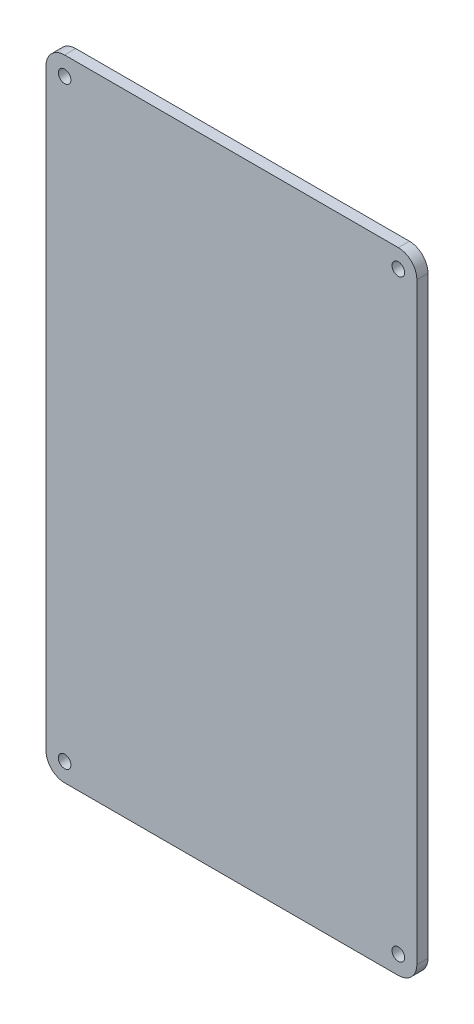
ISO-10303-21;
HEADER;
FILE_DESCRIPTION(('STEP AP214'),'2;1');
FILE_NAME('part.step','',(''),(''),'','','');
FILE_SCHEMA(('AUTOMOTIVE_DESIGN { 1 0 10303 214 1 1 1 1 }'));
ENDSEC;
DATA;
#1=APPLICATION_CONTEXT('core data for automotive mechanical design processes');
#2=APPLICATION_PROTOCOL_DEFINITION('international standard','automotive_design',2000,#1);
#3=PRODUCT_CONTEXT('',#1,'mechanical');
#4=PRODUCT('Part','Part','',(#3));
#5=PRODUCT_RELATED_PRODUCT_CATEGORY('part','',(#4));
#6=PRODUCT_DEFINITION_FORMATION('','',#4);
#7=PRODUCT_DEFINITION_CONTEXT('part definition',#1,'design');
#8=PRODUCT_DEFINITION('design','',#6,#7);
#9=PRODUCT_DEFINITION_SHAPE('','',#8);
#10=(LENGTH_UNIT() NAMED_UNIT(*) SI_UNIT(.MILLI.,.METRE.));
#11=(NAMED_UNIT(*) PLANE_ANGLE_UNIT() SI_UNIT($,.RADIAN.));
#12=(NAMED_UNIT(*) SI_UNIT($,.STERADIAN.) SOLID_ANGLE_UNIT());
#13=UNCERTAINTY_MEASURE_WITH_UNIT(LENGTH_MEASURE(1.E-05),#10,'distance_accuracy_value','');
#14=(GEOMETRIC_REPRESENTATION_CONTEXT(3) GLOBAL_UNCERTAINTY_ASSIGNED_CONTEXT((#13)) GLOBAL_UNIT_ASSIGNED_CONTEXT((#10,
#11,#12)) REPRESENTATION_CONTEXT('',''));
#15=CARTESIAN_POINT('',(0.,0.,0.));
#16=DIRECTION('',(0.,0.,1.));
#17=DIRECTION('',(1.,0.,0.));
#18=AXIS2_PLACEMENT_3D('',#15,#16,#17);
#19=CARTESIAN_POINT('',(0.,0.,3.));
#20=DIRECTION('',(1.,0.,0.));
#21=DIRECTION('',(0.,1.,0.));
#22=AXIS2_PLACEMENT_3D('',#19,#20,#21);
#23=PLANE('',#22);
#24=DIRECTION('',(0.,-1.,0.));
#25=VECTOR('',#24,1.);
#26=CARTESIAN_POINT('',(0.,0.,0.));
#27=LINE('',#26,#25);
#28=CARTESIAN_POINT('',(0.,165.,0.));
#29=VERTEX_POINT('',#28);
#30=CARTESIAN_POINT('',(0.,5.,0.));
#31=VERTEX_POINT('',#30);
#32=EDGE_CURVE('E138',#29,#31,#27,.T.);
#33=ORIENTED_EDGE('',*,*,#32,.T.);
#34=DIRECTION('',(0.,0.,-1.));
#35=VECTOR('',#34,1.);
#36=CARTESIAN_POINT('',(0.,5.,3.));
#37=LINE('',#36,#35);
#38=CARTESIAN_POINT('',(0.,5.,3.));
#39=VERTEX_POINT('',#38);
#40=EDGE_CURVE('E11',#31,#39,#37,.F.);
#41=ORIENTED_EDGE('',*,*,#40,.T.);
#42=DIRECTION('',(0.,-1.,0.));
#43=VECTOR('',#42,1.);
#44=CARTESIAN_POINT('',(0.,0.,3.));
#45=LINE('',#44,#43);
#46=CARTESIAN_POINT('',(0.,165.,3.));
#47=VERTEX_POINT('',#46);
#48=EDGE_CURVE('E126',#47,#39,#45,.T.);
#49=ORIENTED_EDGE('',*,*,#48,.F.);
#50=DIRECTION('',(0.,0.,-1.));
#51=VECTOR('',#50,1.);
#52=CARTESIAN_POINT('',(0.,165.,3.));
#53=LINE('',#52,#51);
#54=EDGE_CURVE('E42',#47,#29,#53,.T.);
#55=ORIENTED_EDGE('',*,*,#54,.T.);
#56=EDGE_LOOP('',(#33,#41,#49,#55));
#57=FACE_BOUND('',#56,.T.);
#58=ADVANCED_FACE('F34',(#57),#23,.F.);
#59=CARTESIAN_POINT('',(0.,0.,3.));
#60=DIRECTION('',(0.,1.,0.));
#61=DIRECTION('',(0.,0.,1.));
#62=AXIS2_PLACEMENT_3D('',#59,#60,#61);
#63=PLANE('',#62);
#64=DIRECTION('',(1.,0.,0.));
#65=VECTOR('',#64,1.);
#66=CARTESIAN_POINT('',(0.,0.,0.));
#67=LINE('',#66,#65);
#68=CARTESIAN_POINT('',(5.,0.,0.));
#69=VERTEX_POINT('',#68);
#70=CARTESIAN_POINT('',(95.,0.,0.));
#71=VERTEX_POINT('',#70);
#72=EDGE_CURVE('E131',#69,#71,#67,.T.);
#73=ORIENTED_EDGE('',*,*,#72,.T.);
#74=DIRECTION('',(0.,0.,-1.));
#75=VECTOR('',#74,1.);
#76=CARTESIAN_POINT('',(95.,0.,3.));
#77=LINE('',#76,#75);
#78=CARTESIAN_POINT('',(95.,0.,3.));
#79=VERTEX_POINT('',#78);
#80=EDGE_CURVE('E49',#71,#79,#77,.F.);
#81=ORIENTED_EDGE('',*,*,#80,.T.);
#82=DIRECTION('',(1.,0.,0.));
#83=VECTOR('',#82,1.);
#84=CARTESIAN_POINT('',(0.,0.,3.));
#85=LINE('',#84,#83);
#86=CARTESIAN_POINT('',(5.,0.,3.));
#87=VERTEX_POINT('',#86);
#88=EDGE_CURVE('E129',#87,#79,#85,.T.);
#89=ORIENTED_EDGE('',*,*,#88,.F.);
#90=DIRECTION('',(0.,0.,-1.));
#91=VECTOR('',#90,1.);
#92=CARTESIAN_POINT('',(5.,0.,3.));
#93=LINE('',#92,#91);
#94=EDGE_CURVE('E163',#87,#69,#93,.T.);
#95=ORIENTED_EDGE('',*,*,#94,.T.);
#96=EDGE_LOOP('',(#73,#81,#89,#95));
#97=FACE_BOUND('',#96,.T.);
#98=ADVANCED_FACE('F213',(#97),#63,.F.);
#99=CARTESIAN_POINT('',(100.,0.,3.));
#100=DIRECTION('',(-1.,0.,0.));
#101=DIRECTION('',(0.,-1.,0.));
#102=AXIS2_PLACEMENT_3D('',#99,#100,#101);
#103=PLANE('',#102);
#104=DIRECTION('',(0.,1.,0.));
#105=VECTOR('',#104,1.);
#106=CARTESIAN_POINT('',(100.,0.,0.));
#107=LINE('',#106,#105);
#108=CARTESIAN_POINT('',(100.,5.,0.));
#109=VERTEX_POINT('',#108);
#110=CARTESIAN_POINT('',(100.,165.,0.));
#111=VERTEX_POINT('',#110);
#112=EDGE_CURVE('E127',#109,#111,#107,.T.);
#113=ORIENTED_EDGE('',*,*,#112,.T.);
#114=DIRECTION('',(0.,0.,-1.));
#115=VECTOR('',#114,1.);
#116=CARTESIAN_POINT('',(100.,165.,3.));
#117=LINE('',#116,#115);
#118=CARTESIAN_POINT('',(100.,165.,3.));
#119=VERTEX_POINT('',#118);
#120=EDGE_CURVE('E105',#111,#119,#117,.F.);
#121=ORIENTED_EDGE('',*,*,#120,.T.);
#122=DIRECTION('',(0.,1.,0.));
#123=VECTOR('',#122,1.);
#124=CARTESIAN_POINT('',(100.,0.,3.));
#125=LINE('',#124,#123);
#126=CARTESIAN_POINT('',(100.,5.,3.));
#127=VERTEX_POINT('',#126);
#128=EDGE_CURVE('E178',#127,#119,#125,.T.);
#129=ORIENTED_EDGE('',*,*,#128,.F.);
#130=DIRECTION('',(0.,0.,-1.));
#131=VECTOR('',#130,1.);
#132=CARTESIAN_POINT('',(100.,5.,3.));
#133=LINE('',#132,#131);
#134=EDGE_CURVE('E110',#127,#109,#133,.T.);
#135=ORIENTED_EDGE('',*,*,#134,.T.);
#136=EDGE_LOOP('',(#113,#121,#129,#135));
#137=FACE_BOUND('',#136,.T.);
#138=ADVANCED_FACE('F210',(#137),#103,.F.);
#139=CARTESIAN_POINT('',(0.,170.,3.));
#140=DIRECTION('',(0.,-1.,0.));
#141=DIRECTION('',(0.,0.,-1.));
#142=AXIS2_PLACEMENT_3D('',#139,#140,#141);
#143=PLANE('',#142);
#144=DIRECTION('',(-1.,0.,0.));
#145=VECTOR('',#144,1.);
#146=CARTESIAN_POINT('',(0.,170.,3.));
#147=LINE('',#146,#145);
#148=CARTESIAN_POINT('',(95.,170.,3.));
#149=VERTEX_POINT('',#148);
#150=CARTESIAN_POINT('',(4.99999999999997,170.,3.));
#151=VERTEX_POINT('',#150);
#152=EDGE_CURVE('E120',#149,#151,#147,.T.);
#153=ORIENTED_EDGE('',*,*,#152,.F.);
#154=DIRECTION('',(0.,0.,-1.));
#155=VECTOR('',#154,1.);
#156=CARTESIAN_POINT('',(95.,170.,3.));
#157=LINE('',#156,#155);
#158=CARTESIAN_POINT('',(95.,170.,0.));
#159=VERTEX_POINT('',#158);
#160=EDGE_CURVE('E104',#149,#159,#157,.T.);
#161=ORIENTED_EDGE('',*,*,#160,.T.);
#162=DIRECTION('',(-1.,0.,0.));
#163=VECTOR('',#162,1.);
#164=CARTESIAN_POINT('',(0.,170.,0.));
#165=LINE('',#164,#163);
#166=CARTESIAN_POINT('',(4.99999999999997,170.,0.));
#167=VERTEX_POINT('',#166);
#168=EDGE_CURVE('E117',#159,#167,#165,.T.);
#169=ORIENTED_EDGE('',*,*,#168,.T.);
#170=DIRECTION('',(0.,0.,-1.));
#171=VECTOR('',#170,1.);
#172=CARTESIAN_POINT('',(4.99999999999997,170.,3.));
#173=LINE('',#172,#171);
#174=EDGE_CURVE('E122',#167,#151,#173,.F.);
#175=ORIENTED_EDGE('',*,*,#174,.T.);
#176=EDGE_LOOP('',(#153,#161,#169,#175));
#177=FACE_BOUND('',#176,.T.);
#178=ADVANCED_FACE('F116',(#177),#143,.F.);
#179=CARTESIAN_POINT('',(0.,0.,3.));
#180=DIRECTION('',(0.,0.,-1.));
#181=DIRECTION('',(-1.,0.,0.));
#182=AXIS2_PLACEMENT_3D('',#179,#180,#181);
#183=PLANE('',#182);
#184=CARTESIAN_POINT('',(4.99999999999997,165.,3.));
#185=DIRECTION('',(0.,0.,1.));
#186=DIRECTION('',(1.,0.,0.));
#187=AXIS2_PLACEMENT_3D('',#184,#185,#186);
#188=CIRCLE('',#187,1.7);
#189=CARTESIAN_POINT('',(6.69999999999997,165.,3.));
#190=VERTEX_POINT('',#189);
#191=EDGE_CURVE('E191',#190,#190,#188,.T.);
#192=ORIENTED_EDGE('',*,*,#191,.F.);
#193=EDGE_LOOP('',(#192));
#194=FACE_BOUND('',#193,.T.);
#195=CARTESIAN_POINT('',(95.,165.,3.));
#196=DIRECTION('',(0.,0.,1.));
#197=DIRECTION('',(1.,0.,0.));
#198=AXIS2_PLACEMENT_3D('',#195,#196,#197);
#199=CIRCLE('',#198,1.69999999999999);
#200=CARTESIAN_POINT('',(96.7,165.,3.));
#201=VERTEX_POINT('',#200);
#202=EDGE_CURVE('E147',#201,#201,#199,.T.);
#203=ORIENTED_EDGE('',*,*,#202,.F.);
#204=EDGE_LOOP('',(#203));
#205=FACE_BOUND('',#204,.T.);
#206=CARTESIAN_POINT('',(95.,5.,3.));
#207=DIRECTION('',(0.,0.,1.));
#208=DIRECTION('',(1.,0.,0.));
#209=AXIS2_PLACEMENT_3D('',#206,#207,#208);
#210=CIRCLE('',#209,1.69999999999999);
#211=CARTESIAN_POINT('',(96.7,5.,3.));
#212=VERTEX_POINT('',#211);
#213=EDGE_CURVE('E143',#212,#212,#210,.T.);
#214=ORIENTED_EDGE('',*,*,#213,.F.);
#215=EDGE_LOOP('',(#214));
#216=FACE_BOUND('',#215,.T.);
#217=CARTESIAN_POINT('',(4.99999999999999,5.,3.));
#218=DIRECTION('',(0.,0.,1.));
#219=DIRECTION('',(1.,0.,0.));
#220=AXIS2_PLACEMENT_3D('',#217,#218,#219);
#221=CIRCLE('',#220,1.7);
#222=CARTESIAN_POINT('',(6.69999999999999,5.,3.));
#223=VERTEX_POINT('',#222);
#224=EDGE_CURVE('E139',#223,#223,#221,.T.);
#225=ORIENTED_EDGE('',*,*,#224,.F.);
#226=EDGE_LOOP('',(#225));
#227=FACE_BOUND('',#226,.T.);
#228=ORIENTED_EDGE('',*,*,#128,.T.);
#229=CARTESIAN_POINT('',(95.,165.,3.));
#230=DIRECTION('',(0.,0.,-1.));
#231=DIRECTION('',(-1.,0.,0.));
#232=AXIS2_PLACEMENT_3D('',#229,#230,#231);
#233=CIRCLE('',#232,5.);
#234=EDGE_CURVE('E161',#119,#149,#233,.F.);
#235=ORIENTED_EDGE('',*,*,#234,.T.);
#236=ORIENTED_EDGE('',*,*,#152,.T.);
#237=CARTESIAN_POINT('',(4.99999999999997,165.,3.));
#238=DIRECTION('',(0.,0.,-1.));
#239=DIRECTION('',(-1.,0.,0.));
#240=AXIS2_PLACEMENT_3D('',#237,#238,#239);
#241=CIRCLE('',#240,5.);
#242=EDGE_CURVE('E156',#151,#47,#241,.F.);
#243=ORIENTED_EDGE('',*,*,#242,.T.);
#244=ORIENTED_EDGE('',*,*,#48,.T.);
#245=CARTESIAN_POINT('',(5.,5.,3.));
#246=DIRECTION('',(0.,0.,-1.));
#247=DIRECTION('',(-1.,0.,0.));
#248=AXIS2_PLACEMENT_3D('',#245,#246,#247);
#249=CIRCLE('',#248,5.);
#250=EDGE_CURVE('E56',#39,#87,#249,.F.);
#251=ORIENTED_EDGE('',*,*,#250,.T.);
#252=ORIENTED_EDGE('',*,*,#88,.T.);
#253=CARTESIAN_POINT('',(95.,5.,3.));
#254=DIRECTION('',(0.,0.,-1.));
#255=DIRECTION('',(-1.,0.,0.));
#256=AXIS2_PLACEMENT_3D('',#253,#254,#255);
#257=CIRCLE('',#256,5.);
#258=EDGE_CURVE('E159',#79,#127,#257,.F.);
#259=ORIENTED_EDGE('',*,*,#258,.T.);
#260=EDGE_LOOP('',(#228,#235,#236,#243,#244,#251,#252,#259));
#261=FACE_BOUND('',#260,.T.);
#262=ADVANCED_FACE('F197',(#194,#205,#216,#227,#261),#183,.F.);
#263=CARTESIAN_POINT('',(0.,0.,0.));
#264=DIRECTION('',(0.,0.,-1.));
#265=DIRECTION('',(-1.,0.,0.));
#266=AXIS2_PLACEMENT_3D('',#263,#264,#265);
#267=PLANE('',#266);
#268=CARTESIAN_POINT('',(4.99999999999997,165.,0.));
#269=DIRECTION('',(0.,0.,-1.));
#270=DIRECTION('',(-1.,0.,0.));
#271=AXIS2_PLACEMENT_3D('',#268,#269,#270);
#272=CIRCLE('',#271,1.7);
#273=CARTESIAN_POINT('',(3.29999999999997,165.,0.));
#274=VERTEX_POINT('',#273);
#275=EDGE_CURVE('E188',#274,#274,#272,.T.);
#276=ORIENTED_EDGE('',*,*,#275,.F.);
#277=EDGE_LOOP('',(#276));
#278=FACE_BOUND('',#277,.T.);
#279=CARTESIAN_POINT('',(95.,165.,0.));
#280=DIRECTION('',(0.,0.,-1.));
#281=DIRECTION('',(-1.,0.,0.));
#282=AXIS2_PLACEMENT_3D('',#279,#280,#281);
#283=CIRCLE('',#282,1.69999999999999);
#284=CARTESIAN_POINT('',(93.3,165.,0.));
#285=VERTEX_POINT('',#284);
#286=EDGE_CURVE('E144',#285,#285,#283,.T.);
#287=ORIENTED_EDGE('',*,*,#286,.F.);
#288=EDGE_LOOP('',(#287));
#289=FACE_BOUND('',#288,.T.);
#290=CARTESIAN_POINT('',(95.,5.,0.));
#291=DIRECTION('',(0.,0.,-1.));
#292=DIRECTION('',(-1.,0.,0.));
#293=AXIS2_PLACEMENT_3D('',#290,#291,#292);
#294=CIRCLE('',#293,1.69999999999999);
#295=CARTESIAN_POINT('',(93.3,5.,0.));
#296=VERTEX_POINT('',#295);
#297=EDGE_CURVE('E140',#296,#296,#294,.T.);
#298=ORIENTED_EDGE('',*,*,#297,.F.);
#299=EDGE_LOOP('',(#298));
#300=FACE_BOUND('',#299,.T.);
#301=CARTESIAN_POINT('',(4.99999999999999,5.,0.));
#302=DIRECTION('',(0.,0.,-1.));
#303=DIRECTION('',(-1.,0.,0.));
#304=AXIS2_PLACEMENT_3D('',#301,#302,#303);
#305=CIRCLE('',#304,1.7);
#306=CARTESIAN_POINT('',(3.29999999999999,5.,0.));
#307=VERTEX_POINT('',#306);
#308=EDGE_CURVE('E135',#307,#307,#305,.T.);
#309=ORIENTED_EDGE('',*,*,#308,.F.);
#310=EDGE_LOOP('',(#309));
#311=FACE_BOUND('',#310,.T.);
#312=ORIENTED_EDGE('',*,*,#168,.F.);
#313=CARTESIAN_POINT('',(95.,165.,0.));
#314=DIRECTION('',(0.,0.,-1.));
#315=DIRECTION('',(-1.,0.,0.));
#316=AXIS2_PLACEMENT_3D('',#313,#314,#315);
#317=CIRCLE('',#316,5.);
#318=EDGE_CURVE('E100',#159,#111,#317,.T.);
#319=ORIENTED_EDGE('',*,*,#318,.T.);
#320=ORIENTED_EDGE('',*,*,#112,.F.);
#321=CARTESIAN_POINT('',(95.,5.,0.));
#322=DIRECTION('',(0.,0.,-1.));
#323=DIRECTION('',(-1.,0.,0.));
#324=AXIS2_PLACEMENT_3D('',#321,#322,#323);
#325=CIRCLE('',#324,5.);
#326=EDGE_CURVE('E111',#109,#71,#325,.T.);
#327=ORIENTED_EDGE('',*,*,#326,.T.);
#328=ORIENTED_EDGE('',*,*,#72,.F.);
#329=CARTESIAN_POINT('',(5.,5.,0.));
#330=DIRECTION('',(0.,0.,-1.));
#331=DIRECTION('',(-1.,0.,0.));
#332=AXIS2_PLACEMENT_3D('',#329,#330,#331);
#333=CIRCLE('',#332,5.);
#334=EDGE_CURVE('E150',#69,#31,#333,.T.);
#335=ORIENTED_EDGE('',*,*,#334,.T.);
#336=ORIENTED_EDGE('',*,*,#32,.F.);
#337=CARTESIAN_POINT('',(4.99999999999997,165.,0.));
#338=DIRECTION('',(0.,0.,-1.));
#339=DIRECTION('',(-1.,0.,0.));
#340=AXIS2_PLACEMENT_3D('',#337,#338,#339);
#341=CIRCLE('',#340,5.);
#342=EDGE_CURVE('E121',#29,#167,#341,.T.);
#343=ORIENTED_EDGE('',*,*,#342,.T.);
#344=EDGE_LOOP('',(#312,#319,#320,#327,#328,#335,#336,#343));
#345=FACE_BOUND('',#344,.T.);
#346=ADVANCED_FACE('F124',(#278,#289,#300,#311,#345),#267,.T.);
#347=CARTESIAN_POINT('',(4.99999999999999,5.,3.));
#348=DIRECTION('',(0.,0.,1.));
#349=DIRECTION('',(1.,0.,0.));
#350=AXIS2_PLACEMENT_3D('',#347,#348,#349);
#351=CYLINDRICAL_SURFACE('',#350,1.7);
#352=ORIENTED_EDGE('',*,*,#308,.T.);
#353=EDGE_LOOP('',(#352));
#354=FACE_BOUND('',#353,.T.);
#355=ORIENTED_EDGE('',*,*,#224,.T.);
#356=EDGE_LOOP('',(#355));
#357=FACE_BOUND('',#356,.T.);
#358=ADVANCED_FACE('F279',(#354,#357),#351,.F.);
#359=CARTESIAN_POINT('',(95.,5.,3.));
#360=DIRECTION('',(0.,0.,1.));
#361=DIRECTION('',(1.,0.,0.));
#362=AXIS2_PLACEMENT_3D('',#359,#360,#361);
#363=CYLINDRICAL_SURFACE('',#362,1.69999999999999);
#364=ORIENTED_EDGE('',*,*,#297,.T.);
#365=EDGE_LOOP('',(#364));
#366=FACE_BOUND('',#365,.T.);
#367=ORIENTED_EDGE('',*,*,#213,.T.);
#368=EDGE_LOOP('',(#367));
#369=FACE_BOUND('',#368,.T.);
#370=ADVANCED_FACE('F270',(#366,#369),#363,.F.);
#371=CARTESIAN_POINT('',(95.,165.,3.));
#372=DIRECTION('',(0.,0.,1.));
#373=DIRECTION('',(1.,0.,0.));
#374=AXIS2_PLACEMENT_3D('',#371,#372,#373);
#375=CYLINDRICAL_SURFACE('',#374,1.69999999999999);
#376=ORIENTED_EDGE('',*,*,#286,.T.);
#377=EDGE_LOOP('',(#376));
#378=FACE_BOUND('',#377,.T.);
#379=ORIENTED_EDGE('',*,*,#202,.T.);
#380=EDGE_LOOP('',(#379));
#381=FACE_BOUND('',#380,.T.);
#382=ADVANCED_FACE('F261',(#378,#381),#375,.F.);
#383=CARTESIAN_POINT('',(4.99999999999997,165.,3.));
#384=DIRECTION('',(0.,0.,1.));
#385=DIRECTION('',(1.,0.,0.));
#386=AXIS2_PLACEMENT_3D('',#383,#384,#385);
#387=CYLINDRICAL_SURFACE('',#386,1.7);
#388=ORIENTED_EDGE('',*,*,#275,.T.);
#389=EDGE_LOOP('',(#388));
#390=FACE_BOUND('',#389,.T.);
#391=ORIENTED_EDGE('',*,*,#191,.T.);
#392=EDGE_LOOP('',(#391));
#393=FACE_BOUND('',#392,.T.);
#394=ADVANCED_FACE('F195',(#390,#393),#387,.F.);
#395=CARTESIAN_POINT('',(95.,165.,3.));
#396=DIRECTION('',(0.,0.,-1.));
#397=DIRECTION('',(-1.,0.,0.));
#398=AXIS2_PLACEMENT_3D('',#395,#396,#397);
#399=CYLINDRICAL_SURFACE('',#398,5.);
#400=ORIENTED_EDGE('',*,*,#234,.F.);
#401=ORIENTED_EDGE('',*,*,#120,.F.);
#402=ORIENTED_EDGE('',*,*,#318,.F.);
#403=ORIENTED_EDGE('',*,*,#160,.F.);
#404=EDGE_LOOP('',(#400,#401,#402,#403));
#405=FACE_BOUND('',#404,.T.);
#406=ADVANCED_FACE('F103',(#405),#399,.T.);
#407=CARTESIAN_POINT('',(95.,5.,3.));
#408=DIRECTION('',(0.,0.,-1.));
#409=DIRECTION('',(-1.,0.,0.));
#410=AXIS2_PLACEMENT_3D('',#407,#408,#409);
#411=CYLINDRICAL_SURFACE('',#410,5.);
#412=ORIENTED_EDGE('',*,*,#258,.F.);
#413=ORIENTED_EDGE('',*,*,#80,.F.);
#414=ORIENTED_EDGE('',*,*,#326,.F.);
#415=ORIENTED_EDGE('',*,*,#134,.F.);
#416=EDGE_LOOP('',(#412,#413,#414,#415));
#417=FACE_BOUND('',#416,.T.);
#418=ADVANCED_FACE('F212',(#417),#411,.T.);
#419=CARTESIAN_POINT('',(5.,5.,3.));
#420=DIRECTION('',(0.,0.,-1.));
#421=DIRECTION('',(-1.,0.,0.));
#422=AXIS2_PLACEMENT_3D('',#419,#420,#421);
#423=CYLINDRICAL_SURFACE('',#422,5.);
#424=ORIENTED_EDGE('',*,*,#250,.F.);
#425=ORIENTED_EDGE('',*,*,#40,.F.);
#426=ORIENTED_EDGE('',*,*,#334,.F.);
#427=ORIENTED_EDGE('',*,*,#94,.F.);
#428=EDGE_LOOP('',(#424,#425,#426,#427));
#429=FACE_BOUND('',#428,.T.);
#430=ADVANCED_FACE('F216',(#429),#423,.T.);
#431=CARTESIAN_POINT('',(4.99999999999997,165.,3.));
#432=DIRECTION('',(0.,0.,-1.));
#433=DIRECTION('',(-1.,0.,0.));
#434=AXIS2_PLACEMENT_3D('',#431,#432,#433);
#435=CYLINDRICAL_SURFACE('',#434,5.);
#436=ORIENTED_EDGE('',*,*,#242,.F.);
#437=ORIENTED_EDGE('',*,*,#174,.F.);
#438=ORIENTED_EDGE('',*,*,#342,.F.);
#439=ORIENTED_EDGE('',*,*,#54,.F.);
#440=EDGE_LOOP('',(#436,#437,#438,#439));
#441=FACE_BOUND('',#440,.T.);
#442=ADVANCED_FACE('F36',(#441),#435,.T.);
#443=CLOSED_SHELL('',(#58,#98,#138,#178,#262,#346,#358,#370,#382,#394,#406,#418,#430,#442));
#444=MANIFOLD_SOLID_BREP('B2',#443);
#445=ADVANCED_BREP_SHAPE_REPRESENTATION('',(#18,#444),#14);
#446=SHAPE_DEFINITION_REPRESENTATION(#9,#445);
ENDSEC;
END-ISO-10303-21;
